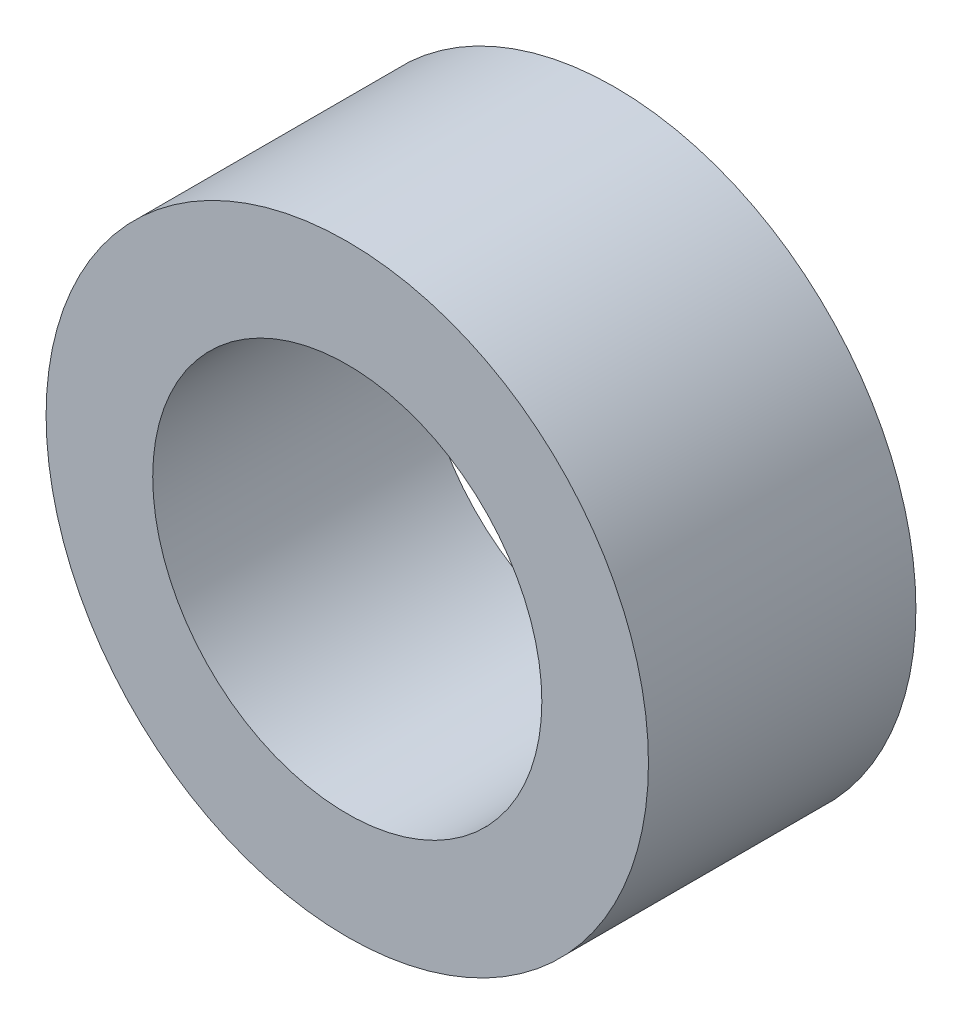
ISO-10303-21;
HEADER;
FILE_DESCRIPTION(('STEP AP214'),'2;1');
FILE_NAME('part.step','',(''),(''),'','','');
FILE_SCHEMA(('AUTOMOTIVE_DESIGN { 1 0 10303 214 1 1 1 1 }'));
ENDSEC;
DATA;
#1=APPLICATION_CONTEXT('core data for automotive mechanical design processes');
#2=APPLICATION_PROTOCOL_DEFINITION('international standard','automotive_design',2000,#1);
#3=PRODUCT_CONTEXT('',#1,'mechanical');
#4=PRODUCT('Part','Part','',(#3));
#5=PRODUCT_RELATED_PRODUCT_CATEGORY('part','',(#4));
#6=PRODUCT_DEFINITION_FORMATION('','',#4);
#7=PRODUCT_DEFINITION_CONTEXT('part definition',#1,'design');
#8=PRODUCT_DEFINITION('design','',#6,#7);
#9=PRODUCT_DEFINITION_SHAPE('','',#8);
#10=(LENGTH_UNIT() NAMED_UNIT(*) SI_UNIT(.MILLI.,.METRE.));
#11=(NAMED_UNIT(*) PLANE_ANGLE_UNIT() SI_UNIT($,.RADIAN.));
#12=(NAMED_UNIT(*) SI_UNIT($,.STERADIAN.) SOLID_ANGLE_UNIT());
#13=UNCERTAINTY_MEASURE_WITH_UNIT(LENGTH_MEASURE(1.E-05),#10,'distance_accuracy_value','');
#14=(GEOMETRIC_REPRESENTATION_CONTEXT(3) GLOBAL_UNCERTAINTY_ASSIGNED_CONTEXT((#13)) GLOBAL_UNIT_ASSIGNED_CONTEXT((#10,
#11,#12)) REPRESENTATION_CONTEXT('',''));
#15=CARTESIAN_POINT('',(0.,0.,0.));
#16=DIRECTION('',(0.,0.,1.));
#17=DIRECTION('',(1.,0.,0.));
#18=AXIS2_PLACEMENT_3D('',#15,#16,#17);
#19=CARTESIAN_POINT('',(0.,0.,5.6388));
#20=DIRECTION('',(0.,0.,1.));
#21=DIRECTION('',(1.,0.,0.));
#22=AXIS2_PLACEMENT_3D('',#19,#20,#21);
#23=PLANE('',#22);
#24=CARTESIAN_POINT('',(0.,0.,5.6388));
#25=DIRECTION('',(0.,0.,1.));
#26=DIRECTION('',(1.,0.,0.));
#27=AXIS2_PLACEMENT_3D('',#24,#25,#26);
#28=CIRCLE('',#27,6.35);
#29=CARTESIAN_POINT('',(6.35,0.,5.6388));
#30=VERTEX_POINT('',#29);
#31=EDGE_CURVE('E10',#30,#30,#28,.T.);
#32=ORIENTED_EDGE('',*,*,#31,.T.);
#33=EDGE_LOOP('',(#32));
#34=FACE_BOUND('',#33,.T.);
#35=CARTESIAN_POINT('',(0.,0.,5.6388));
#36=DIRECTION('',(0.,0.,1.));
#37=DIRECTION('',(1.,0.,0.));
#38=AXIS2_PLACEMENT_3D('',#35,#36,#37);
#39=CIRCLE('',#38,4.1021);
#40=CARTESIAN_POINT('',(4.1021,0.,5.6388));
#41=VERTEX_POINT('',#40);
#42=EDGE_CURVE('E58',#41,#41,#39,.T.);
#43=ORIENTED_EDGE('',*,*,#42,.F.);
#44=EDGE_LOOP('',(#43));
#45=FACE_BOUND('',#44,.T.);
#46=ADVANCED_FACE('F43',(#34,#45),#23,.T.);
#47=CARTESIAN_POINT('',(0.,0.,0.));
#48=DIRECTION('',(0.,0.,1.));
#49=DIRECTION('',(1.,0.,0.));
#50=AXIS2_PLACEMENT_3D('',#47,#48,#49);
#51=PLANE('',#50);
#52=CARTESIAN_POINT('',(0.,0.,0.));
#53=DIRECTION('',(0.,0.,1.));
#54=DIRECTION('',(1.,0.,0.));
#55=AXIS2_PLACEMENT_3D('',#52,#53,#54);
#56=CIRCLE('',#55,6.35);
#57=CARTESIAN_POINT('',(6.35,0.,0.));
#58=VERTEX_POINT('',#57);
#59=EDGE_CURVE('E47',#58,#58,#56,.T.);
#60=ORIENTED_EDGE('',*,*,#59,.F.);
#61=EDGE_LOOP('',(#60));
#62=FACE_BOUND('',#61,.T.);
#63=CARTESIAN_POINT('',(0.,0.,0.));
#64=DIRECTION('',(0.,0.,1.));
#65=DIRECTION('',(1.,0.,0.));
#66=AXIS2_PLACEMENT_3D('',#63,#64,#65);
#67=CIRCLE('',#66,4.1021);
#68=CARTESIAN_POINT('',(4.1021,0.,0.));
#69=VERTEX_POINT('',#68);
#70=EDGE_CURVE('E60',#69,#69,#67,.T.);
#71=ORIENTED_EDGE('',*,*,#70,.T.);
#72=EDGE_LOOP('',(#71));
#73=FACE_BOUND('',#72,.T.);
#74=ADVANCED_FACE('F74',(#62,#73),#51,.F.);
#75=CARTESIAN_POINT('',(0.,0.,5.6388));
#76=DIRECTION('',(0.,0.,-1.));
#77=DIRECTION('',(-1.,0.,0.));
#78=AXIS2_PLACEMENT_3D('',#75,#76,#77);
#79=CYLINDRICAL_SURFACE('',#78,6.35);
#80=ORIENTED_EDGE('',*,*,#31,.F.);
#81=EDGE_LOOP('',(#80));
#82=FACE_BOUND('',#81,.T.);
#83=ORIENTED_EDGE('',*,*,#59,.T.);
#84=EDGE_LOOP('',(#83));
#85=FACE_BOUND('',#84,.T.);
#86=ADVANCED_FACE('F45',(#82,#85),#79,.T.);
#87=CARTESIAN_POINT('',(0.,0.,5.6388));
#88=DIRECTION('',(0.,0.,-1.));
#89=DIRECTION('',(-1.,0.,0.));
#90=AXIS2_PLACEMENT_3D('',#87,#88,#89);
#91=CYLINDRICAL_SURFACE('',#90,4.1021);
#92=ORIENTED_EDGE('',*,*,#42,.T.);
#93=EDGE_LOOP('',(#92));
#94=FACE_BOUND('',#93,.T.);
#95=ORIENTED_EDGE('',*,*,#70,.F.);
#96=EDGE_LOOP('',(#95));
#97=FACE_BOUND('',#96,.T.);
#98=ADVANCED_FACE('F70',(#94,#97),#91,.F.);
#99=CLOSED_SHELL('',(#46,#74,#86,#98));
#100=MANIFOLD_SOLID_BREP('B2',#99);
#101=ADVANCED_BREP_SHAPE_REPRESENTATION('',(#18,#100),#14);
#102=SHAPE_DEFINITION_REPRESENTATION(#9,#101);
ENDSEC;
END-ISO-10303-21;
